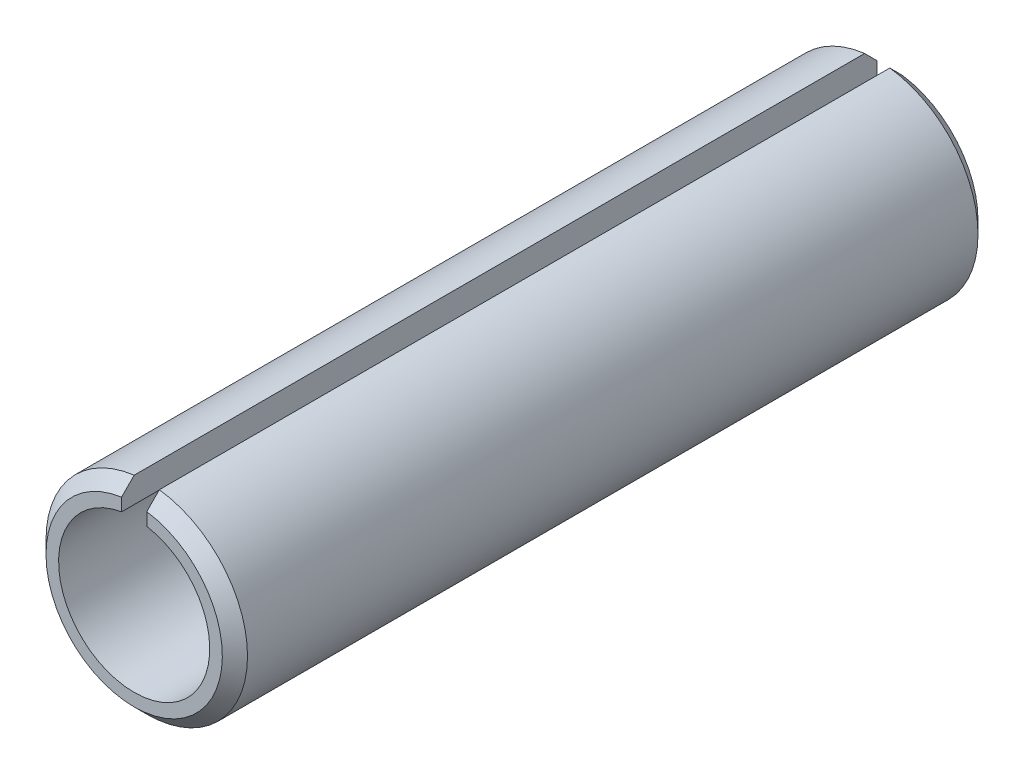
ISO-10303-21;
HEADER;
FILE_DESCRIPTION(('STEP AP214'),'2;1');
FILE_NAME('part.step','',(''),(''),'','','');
FILE_SCHEMA(('AUTOMOTIVE_DESIGN { 1 0 10303 214 1 1 1 1 }'));
ENDSEC;
DATA;
#1=APPLICATION_CONTEXT('core data for automotive mechanical design processes');
#2=APPLICATION_PROTOCOL_DEFINITION('international standard','automotive_design',2000,#1);
#3=PRODUCT_CONTEXT('',#1,'mechanical');
#4=PRODUCT('Part','Part','',(#3));
#5=PRODUCT_RELATED_PRODUCT_CATEGORY('part','',(#4));
#6=PRODUCT_DEFINITION_FORMATION('','',#4);
#7=PRODUCT_DEFINITION_CONTEXT('part definition',#1,'design');
#8=PRODUCT_DEFINITION('design','',#6,#7);
#9=PRODUCT_DEFINITION_SHAPE('','',#8);
#10=(LENGTH_UNIT() NAMED_UNIT(*) SI_UNIT(.MILLI.,.METRE.));
#11=(NAMED_UNIT(*) PLANE_ANGLE_UNIT() SI_UNIT($,.RADIAN.));
#12=(NAMED_UNIT(*) SI_UNIT($,.STERADIAN.) SOLID_ANGLE_UNIT());
#13=UNCERTAINTY_MEASURE_WITH_UNIT(LENGTH_MEASURE(1.E-05),#10,'distance_accuracy_value','');
#14=(GEOMETRIC_REPRESENTATION_CONTEXT(3) GLOBAL_UNCERTAINTY_ASSIGNED_CONTEXT((#13)) GLOBAL_UNIT_ASSIGNED_CONTEXT((#10,
#11,#12)) REPRESENTATION_CONTEXT('',''));
#15=CARTESIAN_POINT('',(0.,0.,0.));
#16=DIRECTION('',(0.,0.,1.));
#17=DIRECTION('',(1.,0.,0.));
#18=AXIS2_PLACEMENT_3D('',#15,#16,#17);
#19=CARTESIAN_POINT('',(0.,0.,15.));
#20=DIRECTION('',(0.,0.,-1.));
#21=DIRECTION('',(-1.,0.,0.));
#22=AXIS2_PLACEMENT_3D('',#19,#20,#21);
#23=CYLINDRICAL_SURFACE('',#22,4.);
#24=DIRECTION('',(0.,0.,-1.));
#25=VECTOR('',#24,1.);
#26=CARTESIAN_POINT('',(-0.5,3.96862696659689,15.));
#27=LINE('',#26,#25);
#28=CARTESIAN_POINT('',(-0.5,3.96862696659689,14.5));
#29=VERTEX_POINT('',#28);
#30=CARTESIAN_POINT('',(-0.5,3.96862696659689,-14.5));
#31=VERTEX_POINT('',#30);
#32=EDGE_CURVE('E131',#29,#31,#27,.T.);
#33=ORIENTED_EDGE('',*,*,#32,.T.);
#34=CARTESIAN_POINT('',(0.,0.,-14.5));
#35=DIRECTION('',(0.,0.,1.));
#36=DIRECTION('',(1.,0.,0.));
#37=AXIS2_PLACEMENT_3D('',#34,#35,#36);
#38=CIRCLE('',#37,4.);
#39=CARTESIAN_POINT('',(0.5,3.96862696659689,-14.5));
#40=VERTEX_POINT('',#39);
#41=EDGE_CURVE('E141',#31,#40,#38,.T.);
#42=ORIENTED_EDGE('',*,*,#41,.T.);
#43=DIRECTION('',(0.,0.,-1.));
#44=VECTOR('',#43,1.);
#45=CARTESIAN_POINT('',(0.5,3.96862696659689,15.));
#46=LINE('',#45,#44);
#47=CARTESIAN_POINT('',(0.5,3.96862696659689,14.5));
#48=VERTEX_POINT('',#47);
#49=EDGE_CURVE('E112',#48,#40,#46,.T.);
#50=ORIENTED_EDGE('',*,*,#49,.F.);
#51=CARTESIAN_POINT('',(0.,0.,14.5));
#52=DIRECTION('',(0.,0.,1.));
#53=DIRECTION('',(1.,0.,0.));
#54=AXIS2_PLACEMENT_3D('',#51,#52,#53);
#55=CIRCLE('',#54,4.);
#56=EDGE_CURVE('E138',#48,#29,#55,.F.);
#57=ORIENTED_EDGE('',*,*,#56,.T.);
#58=EDGE_LOOP('',(#33,#42,#50,#57));
#59=FACE_BOUND('',#58,.T.);
#60=ADVANCED_FACE('F38',(#59),#23,.T.);
#61=CARTESIAN_POINT('',(0.5,3.96862696659689,15.));
#62=DIRECTION('',(1.,0.,0.));
#63=DIRECTION('',(0.,1.,0.));
#64=AXIS2_PLACEMENT_3D('',#61,#62,#63);
#65=PLANE('',#64);
#66=ORIENTED_EDGE('',*,*,#49,.T.);
#67=CARTESIAN_POINT('',(0.5,3.96862696659689,-14.5));
#68=CARTESIAN_POINT('',(0.5,3.88458991571911,-14.5833842971325));
#69=CARTESIAN_POINT('',(0.5,3.80052761124953,-14.6667431121105));
#70=CARTESIAN_POINT('',(0.5,3.63235249409711,-14.8334097787778));
#71=CARTESIAN_POINT('',(0.5,3.54823968141364,-14.9167176304665));
#72=CARTESIAN_POINT('',(0.5,3.46410161513775,-15.));
#73=B_SPLINE_CURVE_WITH_KNOTS('',3,(#67,#68,#69,#70,#71,#72),.UNSPECIFIED.,.F.,.F.,(4,2,4),(0.,
0.355156961927304,0.71031392820357),.UNSPECIFIED.);
#74=CARTESIAN_POINT('',(0.5,3.46410161513775,-15.));
#75=VERTEX_POINT('',#74);
#76=EDGE_CURVE('E101',#40,#75,#73,.T.);
#77=ORIENTED_EDGE('',*,*,#76,.T.);
#78=DIRECTION('',(0.,-1.,0.));
#79=VECTOR('',#78,1.);
#80=CARTESIAN_POINT('',(0.5,3.96862696659689,-15.));
#81=LINE('',#80,#79);
#82=CARTESIAN_POINT('',(0.5,2.95803989154981,-15.));
#83=VERTEX_POINT('',#82);
#84=EDGE_CURVE('E94',#75,#83,#81,.T.);
#85=ORIENTED_EDGE('',*,*,#84,.T.);
#86=DIRECTION('',(0.,0.,-1.));
#87=VECTOR('',#86,1.);
#88=CARTESIAN_POINT('',(0.5,2.95803989154981,15.));
#89=LINE('',#88,#87);
#90=CARTESIAN_POINT('',(0.5,2.95803989154981,15.));
#91=VERTEX_POINT('',#90);
#92=EDGE_CURVE('E99',#91,#83,#89,.T.);
#93=ORIENTED_EDGE('',*,*,#92,.F.);
#94=DIRECTION('',(0.,-1.,0.));
#95=VECTOR('',#94,1.);
#96=CARTESIAN_POINT('',(0.5,3.96862696659689,15.));
#97=LINE('',#96,#95);
#98=CARTESIAN_POINT('',(0.5,3.46410161513775,15.));
#99=VERTEX_POINT('',#98);
#100=EDGE_CURVE('E121',#99,#91,#97,.T.);
#101=ORIENTED_EDGE('',*,*,#100,.F.);
#102=CARTESIAN_POINT('',(0.5,3.46410161513776,15.));
#103=CARTESIAN_POINT('',(0.5,3.54823968141364,14.9167176304665));
#104=CARTESIAN_POINT('',(0.5,3.63235249409711,14.8334097787778));
#105=CARTESIAN_POINT('',(0.5,3.80052761124953,14.6667431121105));
#106=CARTESIAN_POINT('',(0.5,3.88458991571911,14.5833842971325));
#107=CARTESIAN_POINT('',(0.5,3.96862696659689,14.5));
#108=B_SPLINE_CURVE_WITH_KNOTS('',3,(#102,#103,#104,#105,#106,#107),.UNSPECIFIED.,.F.,.F.,(4,2,
4),(0.,0.355156966276267,0.710313928203573),.UNSPECIFIED.);
#109=EDGE_CURVE('E145',#99,#48,#108,.T.);
#110=ORIENTED_EDGE('',*,*,#109,.T.);
#111=EDGE_LOOP('',(#66,#77,#85,#93,#101,#110));
#112=FACE_BOUND('',#111,.T.);
#113=ADVANCED_FACE('F97',(#112),#65,.F.);
#114=CARTESIAN_POINT('',(0.,0.,15.));
#115=DIRECTION('',(0.,0.,-1.));
#116=DIRECTION('',(-1.,0.,0.));
#117=AXIS2_PLACEMENT_3D('',#114,#115,#116);
#118=CYLINDRICAL_SURFACE('',#117,3.);
#119=ORIENTED_EDGE('',*,*,#92,.T.);
#120=CARTESIAN_POINT('',(0.,0.,-15.));
#121=DIRECTION('',(0.,0.,-1.));
#122=DIRECTION('',(1.,0.,0.));
#123=AXIS2_PLACEMENT_3D('',#120,#121,#122);
#124=CIRCLE('',#123,3.);
#125=CARTESIAN_POINT('',(-0.5,2.95803989154981,-15.));
#126=VERTEX_POINT('',#125);
#127=EDGE_CURVE('E104',#83,#126,#124,.T.);
#128=ORIENTED_EDGE('',*,*,#127,.T.);
#129=DIRECTION('',(0.,0.,-1.));
#130=VECTOR('',#129,1.);
#131=CARTESIAN_POINT('',(-0.5,2.95803989154981,15.));
#132=LINE('',#131,#130);
#133=CARTESIAN_POINT('',(-0.5,2.95803989154981,15.));
#134=VERTEX_POINT('',#133);
#135=EDGE_CURVE('E113',#134,#126,#132,.T.);
#136=ORIENTED_EDGE('',*,*,#135,.F.);
#137=CARTESIAN_POINT('',(0.,0.,15.));
#138=DIRECTION('',(0.,0.,-1.));
#139=DIRECTION('',(1.,0.,0.));
#140=AXIS2_PLACEMENT_3D('',#137,#138,#139);
#141=CIRCLE('',#140,3.);
#142=EDGE_CURVE('E110',#91,#134,#141,.T.);
#143=ORIENTED_EDGE('',*,*,#142,.F.);
#144=EDGE_LOOP('',(#119,#128,#136,#143));
#145=FACE_BOUND('',#144,.T.);
#146=ADVANCED_FACE('F108',(#145),#118,.F.);
#147=CARTESIAN_POINT('',(-0.5,3.96862696659689,15.));
#148=DIRECTION('',(-1.,0.,0.));
#149=DIRECTION('',(0.,-1.,0.));
#150=AXIS2_PLACEMENT_3D('',#147,#148,#149);
#151=PLANE('',#150);
#152=DIRECTION('',(0.,1.,0.));
#153=VECTOR('',#152,1.);
#154=CARTESIAN_POINT('',(-0.5,3.96862696659689,-15.));
#155=LINE('',#154,#153);
#156=CARTESIAN_POINT('',(-0.5,3.46410161513775,-15.));
#157=VERTEX_POINT('',#156);
#158=EDGE_CURVE('E116',#126,#157,#155,.T.);
#159=ORIENTED_EDGE('',*,*,#158,.T.);
#160=CARTESIAN_POINT('',(-0.5,3.46410161513775,-15.));
#161=CARTESIAN_POINT('',(-0.5,3.54823968141364,-14.9167176304665));
#162=CARTESIAN_POINT('',(-0.5,3.63235249409711,-14.8334097787778));
#163=CARTESIAN_POINT('',(-0.5,3.80052761124953,-14.6667431121105));
#164=CARTESIAN_POINT('',(-0.5,3.88458991571911,-14.5833842971325));
#165=CARTESIAN_POINT('',(-0.5,3.96862696659689,-14.5));
#166=B_SPLINE_CURVE_WITH_KNOTS('',3,(#160,#161,#162,#163,#164,#165),.UNSPECIFIED.,.F.,.F.,(4,2,
4),(0.,0.355156966276265,0.710313928203569),.UNSPECIFIED.);
#167=EDGE_CURVE('E46',#157,#31,#166,.T.);
#168=ORIENTED_EDGE('',*,*,#167,.T.);
#169=ORIENTED_EDGE('',*,*,#32,.F.);
#170=CARTESIAN_POINT('',(-0.5,3.96862696659689,14.5));
#171=CARTESIAN_POINT('',(-0.5,3.88458991571911,14.5833842971325));
#172=CARTESIAN_POINT('',(-0.5,3.80052761124953,14.6667431121105));
#173=CARTESIAN_POINT('',(-0.5,3.63235249409711,14.8334097787778));
#174=CARTESIAN_POINT('',(-0.5,3.54823968141364,14.9167176304665));
#175=CARTESIAN_POINT('',(-0.5,3.46410161513776,15.));
#176=B_SPLINE_CURVE_WITH_KNOTS('',3,(#170,#171,#172,#173,#174,#175),.UNSPECIFIED.,.F.,.F.,(4,2,
4),(0.,0.355156961927307,0.710313928203574),.UNSPECIFIED.);
#177=CARTESIAN_POINT('',(-0.5,3.46410161513775,15.));
#178=VERTEX_POINT('',#177);
#179=EDGE_CURVE('E53',#29,#178,#176,.T.);
#180=ORIENTED_EDGE('',*,*,#179,.T.);
#181=DIRECTION('',(0.,1.,0.));
#182=VECTOR('',#181,1.);
#183=CARTESIAN_POINT('',(-0.5,3.96862696659689,15.));
#184=LINE('',#183,#182);
#185=EDGE_CURVE('E128',#134,#178,#184,.T.);
#186=ORIENTED_EDGE('',*,*,#185,.F.);
#187=ORIENTED_EDGE('',*,*,#135,.T.);
#188=EDGE_LOOP('',(#159,#168,#169,#180,#186,#187));
#189=FACE_BOUND('',#188,.T.);
#190=ADVANCED_FACE('F167',(#189),#151,.F.);
#191=CARTESIAN_POINT('',(0.,0.,15.));
#192=DIRECTION('',(0.,0.,1.));
#193=DIRECTION('',(1.,0.,0.));
#194=AXIS2_PLACEMENT_3D('',#191,#192,#193);
#195=PLANE('',#194);
#196=ORIENTED_EDGE('',*,*,#185,.T.);
#197=CARTESIAN_POINT('',(0.,0.,15.));
#198=DIRECTION('',(0.,0.,1.));
#199=DIRECTION('',(1.,0.,0.));
#200=AXIS2_PLACEMENT_3D('',#197,#198,#199);
#201=CIRCLE('',#200,3.5);
#202=EDGE_CURVE('E11',#178,#99,#201,.T.);
#203=ORIENTED_EDGE('',*,*,#202,.T.);
#204=ORIENTED_EDGE('',*,*,#100,.T.);
#205=ORIENTED_EDGE('',*,*,#142,.T.);
#206=EDGE_LOOP('',(#196,#203,#204,#205));
#207=FACE_BOUND('',#206,.T.);
#208=ADVANCED_FACE('F171',(#207),#195,.T.);
#209=CARTESIAN_POINT('',(0.,0.,-15.));
#210=DIRECTION('',(0.,0.,1.));
#211=DIRECTION('',(1.,0.,0.));
#212=AXIS2_PLACEMENT_3D('',#209,#210,#211);
#213=PLANE('',#212);
#214=ORIENTED_EDGE('',*,*,#84,.F.);
#215=CARTESIAN_POINT('',(0.,0.,-15.));
#216=DIRECTION('',(0.,0.,1.));
#217=DIRECTION('',(1.,0.,0.));
#218=AXIS2_PLACEMENT_3D('',#215,#216,#217);
#219=CIRCLE('',#218,3.5);
#220=EDGE_CURVE('E61',#75,#157,#219,.F.);
#221=ORIENTED_EDGE('',*,*,#220,.T.);
#222=ORIENTED_EDGE('',*,*,#158,.F.);
#223=ORIENTED_EDGE('',*,*,#127,.F.);
#224=EDGE_LOOP('',(#214,#221,#222,#223));
#225=FACE_BOUND('',#224,.T.);
#226=ADVANCED_FACE('F115',(#225),#213,.F.);
#227=CARTESIAN_POINT('',(0.,0.,-14.5));
#228=DIRECTION('',(0.,0.,1.));
#229=DIRECTION('',(1.,0.,0.));
#230=AXIS2_PLACEMENT_3D('',#227,#228,#229);
#231=CONICAL_SURFACE('',#230,4.,0.785398163397451);
#232=ORIENTED_EDGE('',*,*,#167,.F.);
#233=ORIENTED_EDGE('',*,*,#220,.F.);
#234=ORIENTED_EDGE('',*,*,#76,.F.);
#235=ORIENTED_EDGE('',*,*,#41,.F.);
#236=EDGE_LOOP('',(#232,#233,#234,#235));
#237=FACE_BOUND('',#236,.T.);
#238=ADVANCED_FACE('F184',(#237),#231,.T.);
#239=CARTESIAN_POINT('',(0.,0.,15.));
#240=DIRECTION('',(0.,0.,-1.));
#241=DIRECTION('',(-1.,0.,0.));
#242=AXIS2_PLACEMENT_3D('',#239,#240,#241);
#243=CONICAL_SURFACE('',#242,3.5,0.785398163397444);
#244=ORIENTED_EDGE('',*,*,#179,.F.);
#245=ORIENTED_EDGE('',*,*,#56,.F.);
#246=ORIENTED_EDGE('',*,*,#109,.F.);
#247=ORIENTED_EDGE('',*,*,#202,.F.);
#248=EDGE_LOOP('',(#244,#245,#246,#247));
#249=FACE_BOUND('',#248,.T.);
#250=ADVANCED_FACE('F159',(#249),#243,.T.);
#251=CLOSED_SHELL('',(#60,#113,#146,#190,#208,#226,#238,#250));
#252=MANIFOLD_SOLID_BREP('B2',#251);
#253=ADVANCED_BREP_SHAPE_REPRESENTATION('',(#18,#252),#14);
#254=SHAPE_DEFINITION_REPRESENTATION(#9,#253);
ENDSEC;
END-ISO-10303-21;
